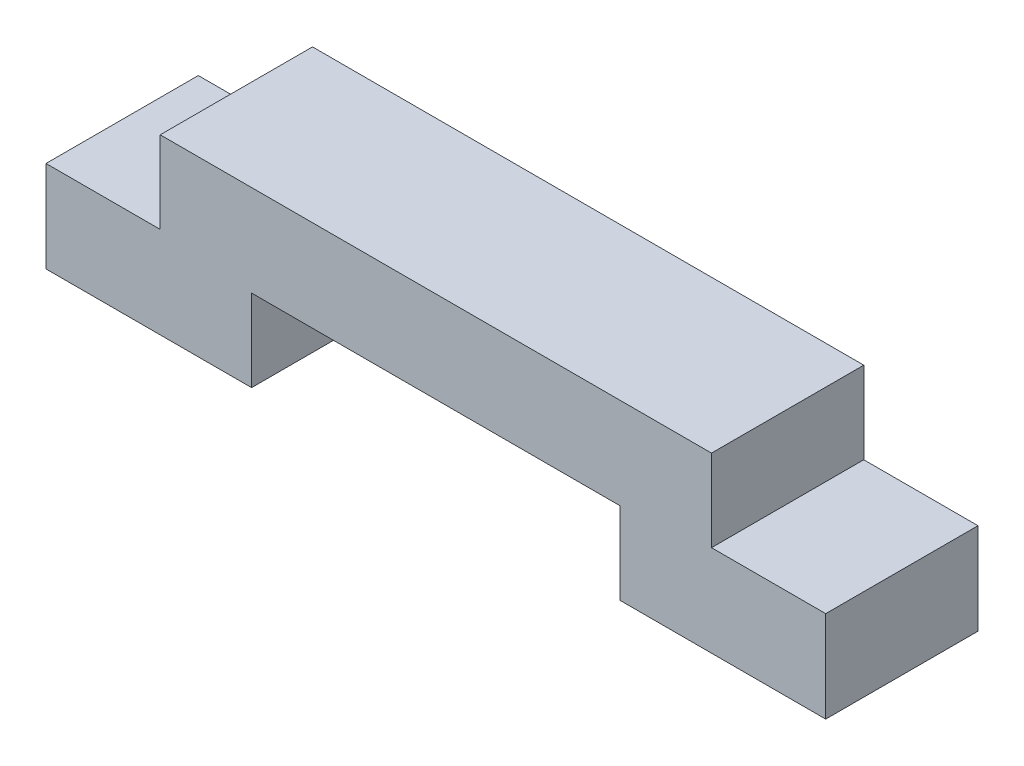
ISO-10303-21;
HEADER;
FILE_DESCRIPTION(('STEP AP214'),'2;1');
FILE_NAME('part.step','',(''),(''),'','','');
FILE_SCHEMA(('AUTOMOTIVE_DESIGN { 1 0 10303 214 1 1 1 1 }'));
ENDSEC;
DATA;
#1=APPLICATION_CONTEXT('core data for automotive mechanical design processes');
#2=APPLICATION_PROTOCOL_DEFINITION('international standard','automotive_design',2000,#1);
#3=PRODUCT_CONTEXT('',#1,'mechanical');
#4=PRODUCT('Part','Part','',(#3));
#5=PRODUCT_RELATED_PRODUCT_CATEGORY('part','',(#4));
#6=PRODUCT_DEFINITION_FORMATION('','',#4);
#7=PRODUCT_DEFINITION_CONTEXT('part definition',#1,'design');
#8=PRODUCT_DEFINITION('design','',#6,#7);
#9=PRODUCT_DEFINITION_SHAPE('','',#8);
#10=(LENGTH_UNIT() NAMED_UNIT(*) SI_UNIT(.MILLI.,.METRE.));
#11=(NAMED_UNIT(*) PLANE_ANGLE_UNIT() SI_UNIT($,.RADIAN.));
#12=(NAMED_UNIT(*) SI_UNIT($,.STERADIAN.) SOLID_ANGLE_UNIT());
#13=UNCERTAINTY_MEASURE_WITH_UNIT(LENGTH_MEASURE(1.E-05),#10,'distance_accuracy_value','');
#14=(GEOMETRIC_REPRESENTATION_CONTEXT(3) GLOBAL_UNCERTAINTY_ASSIGNED_CONTEXT((#13)) GLOBAL_UNIT_ASSIGNED_CONTEXT((#10,
#11,#12)) REPRESENTATION_CONTEXT('',''));
#15=CARTESIAN_POINT('',(0.,0.,0.));
#16=DIRECTION('',(0.,0.,1.));
#17=DIRECTION('',(1.,0.,0.));
#18=AXIS2_PLACEMENT_3D('',#15,#16,#17);
#19=CARTESIAN_POINT('',(-27.4736842105263,2.36842105263157,5.));
#20=DIRECTION('',(1.,0.,0.));
#21=DIRECTION('',(0.,0.,-1.));
#22=AXIS2_PLACEMENT_3D('',#19,#20,#21);
#23=PLANE('',#22);
#24=DIRECTION('',(0.,-1.,0.));
#25=VECTOR('',#24,1.);
#26=CARTESIAN_POINT('',(-27.4736842105263,2.36842105263157,0.));
#27=LINE('',#26,#25);
#28=CARTESIAN_POINT('',(-27.4736842105263,2.36842105263157,0.));
#29=VERTEX_POINT('',#28);
#30=CARTESIAN_POINT('',(-27.4736842105263,-0.631578947368426,0.));
#31=VERTEX_POINT('',#30);
#32=EDGE_CURVE('E162',#29,#31,#27,.T.);
#33=ORIENTED_EDGE('',*,*,#32,.T.);
#34=DIRECTION('',(0.,0.,-1.));
#35=VECTOR('',#34,1.);
#36=CARTESIAN_POINT('',(-27.4736842105263,-0.631578947368426,5.));
#37=LINE('',#36,#35);
#38=CARTESIAN_POINT('',(-27.4736842105263,-0.631578947368426,5.));
#39=VERTEX_POINT('',#38);
#40=EDGE_CURVE('E11',#39,#31,#37,.T.);
#41=ORIENTED_EDGE('',*,*,#40,.F.);
#42=DIRECTION('',(0.,-1.,0.));
#43=VECTOR('',#42,1.);
#44=CARTESIAN_POINT('',(-27.4736842105263,2.36842105263157,5.));
#45=LINE('',#44,#43);
#46=CARTESIAN_POINT('',(-27.4736842105263,2.36842105263157,5.));
#47=VERTEX_POINT('',#46);
#48=EDGE_CURVE('E183',#47,#39,#45,.T.);
#49=ORIENTED_EDGE('',*,*,#48,.F.);
#50=DIRECTION('',(0.,0.,-1.));
#51=VECTOR('',#50,1.);
#52=CARTESIAN_POINT('',(-27.4736842105263,2.36842105263157,5.));
#53=LINE('',#52,#51);
#54=EDGE_CURVE('E160',#47,#29,#53,.T.);
#55=ORIENTED_EDGE('',*,*,#54,.T.);
#56=EDGE_LOOP('',(#33,#41,#49,#55));
#57=FACE_BOUND('',#56,.T.);
#58=ADVANCED_FACE('F41',(#57),#23,.F.);
#59=CARTESIAN_POINT('',(-27.4736842105263,-0.631578947368426,5.));
#60=DIRECTION('',(0.,1.,0.));
#61=DIRECTION('',(0.,0.,1.));
#62=AXIS2_PLACEMENT_3D('',#59,#60,#61);
#63=PLANE('',#62);
#64=DIRECTION('',(1.,0.,0.));
#65=VECTOR('',#64,1.);
#66=CARTESIAN_POINT('',(-27.4736842105263,-0.631578947368426,0.));
#67=LINE('',#66,#65);
#68=CARTESIAN_POINT('',(-20.7236842105263,-0.631578947368426,0.));
#69=VERTEX_POINT('',#68);
#70=EDGE_CURVE('E164',#31,#69,#67,.T.);
#71=ORIENTED_EDGE('',*,*,#70,.T.);
#72=DIRECTION('',(0.,0.,-1.));
#73=VECTOR('',#72,1.);
#74=CARTESIAN_POINT('',(-20.7236842105263,-0.631578947368426,5.));
#75=LINE('',#74,#73);
#76=CARTESIAN_POINT('',(-20.7236842105263,-0.631578947368426,5.));
#77=VERTEX_POINT('',#76);
#78=EDGE_CURVE('E47',#77,#69,#75,.T.);
#79=ORIENTED_EDGE('',*,*,#78,.F.);
#80=DIRECTION('',(1.,0.,0.));
#81=VECTOR('',#80,1.);
#82=CARTESIAN_POINT('',(-27.4736842105263,-0.631578947368426,5.));
#83=LINE('',#82,#81);
#84=EDGE_CURVE('E115',#39,#77,#83,.T.);
#85=ORIENTED_EDGE('',*,*,#84,.F.);
#86=ORIENTED_EDGE('',*,*,#40,.T.);
#87=EDGE_LOOP('',(#71,#79,#85,#86));
#88=FACE_BOUND('',#87,.T.);
#89=ADVANCED_FACE('F263',(#88),#63,.F.);
#90=CARTESIAN_POINT('',(-20.7236842105263,-0.631578947368426,5.));
#91=DIRECTION('',(-1.,0.,0.));
#92=DIRECTION('',(0.,0.,1.));
#93=AXIS2_PLACEMENT_3D('',#90,#91,#92);
#94=PLANE('',#93);
#95=DIRECTION('',(0.,1.,0.));
#96=VECTOR('',#95,1.);
#97=CARTESIAN_POINT('',(-20.7236842105263,-0.631578947368426,0.));
#98=LINE('',#97,#96);
#99=CARTESIAN_POINT('',(-20.7236842105263,2.05842105263157,0.));
#100=VERTEX_POINT('',#99);
#101=EDGE_CURVE('E168',#69,#100,#98,.T.);
#102=ORIENTED_EDGE('',*,*,#101,.T.);
#103=DIRECTION('',(0.,0.,-1.));
#104=VECTOR('',#103,1.);
#105=CARTESIAN_POINT('',(-20.7236842105263,2.05842105263157,5.));
#106=LINE('',#105,#104);
#107=CARTESIAN_POINT('',(-20.7236842105263,2.05842105263157,5.));
#108=VERTEX_POINT('',#107);
#109=EDGE_CURVE('E205',#108,#100,#106,.T.);
#110=ORIENTED_EDGE('',*,*,#109,.F.);
#111=DIRECTION('',(0.,1.,0.));
#112=VECTOR('',#111,1.);
#113=CARTESIAN_POINT('',(-20.7236842105263,-0.631578947368426,5.));
#114=LINE('',#113,#112);
#115=EDGE_CURVE('E206',#77,#108,#114,.T.);
#116=ORIENTED_EDGE('',*,*,#115,.F.);
#117=ORIENTED_EDGE('',*,*,#78,.T.);
#118=EDGE_LOOP('',(#102,#110,#116,#117));
#119=FACE_BOUND('',#118,.T.);
#120=ADVANCED_FACE('F208',(#119),#94,.F.);
#121=CARTESIAN_POINT('',(-20.7236842105263,2.05842105263157,5.));
#122=DIRECTION('',(0.,1.,0.));
#123=DIRECTION('',(-1.,0.,0.));
#124=AXIS2_PLACEMENT_3D('',#121,#122,#123);
#125=PLANE('',#124);
#126=DIRECTION('',(1.,0.,0.));
#127=VECTOR('',#126,1.);
#128=CARTESIAN_POINT('',(-20.7236842105263,2.05842105263157,0.));
#129=LINE('',#128,#127);
#130=CARTESIAN_POINT('',(-8.62368421052626,2.05842105263158,0.));
#131=VERTEX_POINT('',#130);
#132=EDGE_CURVE('E166',#100,#131,#129,.T.);
#133=ORIENTED_EDGE('',*,*,#132,.T.);
#134=DIRECTION('',(0.,0.,-1.));
#135=VECTOR('',#134,1.);
#136=CARTESIAN_POINT('',(-8.62368421052626,2.05842105263158,5.));
#137=LINE('',#136,#135);
#138=CARTESIAN_POINT('',(-8.62368421052626,2.05842105263158,5.));
#139=VERTEX_POINT('',#138);
#140=EDGE_CURVE('E199',#139,#131,#137,.T.);
#141=ORIENTED_EDGE('',*,*,#140,.F.);
#142=DIRECTION('',(1.,0.,0.));
#143=VECTOR('',#142,1.);
#144=CARTESIAN_POINT('',(-20.7236842105263,2.05842105263157,5.));
#145=LINE('',#144,#143);
#146=EDGE_CURVE('E228',#108,#139,#145,.T.);
#147=ORIENTED_EDGE('',*,*,#146,.F.);
#148=ORIENTED_EDGE('',*,*,#109,.T.);
#149=EDGE_LOOP('',(#133,#141,#147,#148));
#150=FACE_BOUND('',#149,.T.);
#151=ADVANCED_FACE('F219',(#150),#125,.F.);
#152=CARTESIAN_POINT('',(-8.62368421052626,2.05842105263158,5.));
#153=DIRECTION('',(1.,0.,0.));
#154=DIRECTION('',(0.,0.,-1.));
#155=AXIS2_PLACEMENT_3D('',#152,#153,#154);
#156=PLANE('',#155);
#157=DIRECTION('',(0.,-1.,0.));
#158=VECTOR('',#157,1.);
#159=CARTESIAN_POINT('',(-8.62368421052626,2.05842105263158,0.));
#160=LINE('',#159,#158);
#161=CARTESIAN_POINT('',(-8.62368421052626,-0.631578947368426,0.));
#162=VERTEX_POINT('',#161);
#163=EDGE_CURVE('E169',#131,#162,#160,.T.);
#164=ORIENTED_EDGE('',*,*,#163,.T.);
#165=DIRECTION('',(0.,0.,-1.));
#166=VECTOR('',#165,1.);
#167=CARTESIAN_POINT('',(-8.62368421052626,-0.631578947368426,5.));
#168=LINE('',#167,#166);
#169=CARTESIAN_POINT('',(-8.62368421052626,-0.631578947368426,5.));
#170=VERTEX_POINT('',#169);
#171=EDGE_CURVE('E197',#170,#162,#168,.T.);
#172=ORIENTED_EDGE('',*,*,#171,.F.);
#173=DIRECTION('',(0.,-1.,0.));
#174=VECTOR('',#173,1.);
#175=CARTESIAN_POINT('',(-8.62368421052626,2.05842105263158,5.));
#176=LINE('',#175,#174);
#177=EDGE_CURVE('E224',#139,#170,#176,.T.);
#178=ORIENTED_EDGE('',*,*,#177,.F.);
#179=ORIENTED_EDGE('',*,*,#140,.T.);
#180=EDGE_LOOP('',(#164,#172,#178,#179));
#181=FACE_BOUND('',#180,.T.);
#182=ADVANCED_FACE('F223',(#181),#156,.F.);
#183=CARTESIAN_POINT('',(-8.62368421052626,-0.631578947368426,5.));
#184=DIRECTION('',(0.,1.,0.));
#185=DIRECTION('',(-1.,0.,0.));
#186=AXIS2_PLACEMENT_3D('',#183,#184,#185);
#187=PLANE('',#186);
#188=DIRECTION('',(1.,0.,0.));
#189=VECTOR('',#188,1.);
#190=CARTESIAN_POINT('',(-8.62368421052626,-0.631578947368426,0.));
#191=LINE('',#190,#189);
#192=CARTESIAN_POINT('',(-1.87368421052626,-0.631578947368426,0.));
#193=VERTEX_POINT('',#192);
#194=EDGE_CURVE('E175',#162,#193,#191,.T.);
#195=ORIENTED_EDGE('',*,*,#194,.T.);
#196=DIRECTION('',(0.,0.,-1.));
#197=VECTOR('',#196,1.);
#198=CARTESIAN_POINT('',(-1.87368421052626,-0.631578947368426,5.));
#199=LINE('',#198,#197);
#200=CARTESIAN_POINT('',(-1.87368421052626,-0.631578947368426,5.));
#201=VERTEX_POINT('',#200);
#202=EDGE_CURVE('E194',#201,#193,#199,.T.);
#203=ORIENTED_EDGE('',*,*,#202,.F.);
#204=DIRECTION('',(1.,0.,0.));
#205=VECTOR('',#204,1.);
#206=CARTESIAN_POINT('',(-8.62368421052626,-0.631578947368426,5.));
#207=LINE('',#206,#205);
#208=EDGE_CURVE('E230',#170,#201,#207,.T.);
#209=ORIENTED_EDGE('',*,*,#208,.F.);
#210=ORIENTED_EDGE('',*,*,#171,.T.);
#211=EDGE_LOOP('',(#195,#203,#209,#210));
#212=FACE_BOUND('',#211,.T.);
#213=ADVANCED_FACE('F272',(#212),#187,.F.);
#214=CARTESIAN_POINT('',(-1.87368421052626,-0.631578947368426,5.));
#215=DIRECTION('',(-1.,0.,0.));
#216=DIRECTION('',(0.,0.,1.));
#217=AXIS2_PLACEMENT_3D('',#214,#215,#216);
#218=PLANE('',#217);
#219=DIRECTION('',(0.,1.,0.));
#220=VECTOR('',#219,1.);
#221=CARTESIAN_POINT('',(-1.87368421052626,-0.631578947368426,0.));
#222=LINE('',#221,#220);
#223=CARTESIAN_POINT('',(-1.87368421052626,2.36842105263158,0.));
#224=VERTEX_POINT('',#223);
#225=EDGE_CURVE('E174',#193,#224,#222,.T.);
#226=ORIENTED_EDGE('',*,*,#225,.T.);
#227=DIRECTION('',(0.,0.,-1.));
#228=VECTOR('',#227,1.);
#229=CARTESIAN_POINT('',(-1.87368421052626,2.36842105263158,5.));
#230=LINE('',#229,#228);
#231=CARTESIAN_POINT('',(-1.87368421052626,2.36842105263158,5.));
#232=VERTEX_POINT('',#231);
#233=EDGE_CURVE('E189',#232,#224,#230,.T.);
#234=ORIENTED_EDGE('',*,*,#233,.F.);
#235=DIRECTION('',(0.,1.,0.));
#236=VECTOR('',#235,1.);
#237=CARTESIAN_POINT('',(-1.87368421052626,-0.631578947368426,5.));
#238=LINE('',#237,#236);
#239=EDGE_CURVE('E229',#201,#232,#238,.T.);
#240=ORIENTED_EDGE('',*,*,#239,.F.);
#241=ORIENTED_EDGE('',*,*,#202,.T.);
#242=EDGE_LOOP('',(#226,#234,#240,#241));
#243=FACE_BOUND('',#242,.T.);
#244=ADVANCED_FACE('F280',(#243),#218,.F.);
#245=CARTESIAN_POINT('',(-1.87368421052626,2.36842105263158,5.));
#246=DIRECTION('',(0.,-1.,0.));
#247=DIRECTION('',(1.,0.,0.));
#248=AXIS2_PLACEMENT_3D('',#245,#246,#247);
#249=PLANE('',#248);
#250=DIRECTION('',(-1.,0.,0.));
#251=VECTOR('',#250,1.);
#252=CARTESIAN_POINT('',(-1.87368421052626,2.36842105263158,0.));
#253=LINE('',#252,#251);
#254=CARTESIAN_POINT('',(-5.62368421052626,2.36842105263158,0.));
#255=VERTEX_POINT('',#254);
#256=EDGE_CURVE('E176',#224,#255,#253,.T.);
#257=ORIENTED_EDGE('',*,*,#256,.T.);
#258=DIRECTION('',(0.,0.,-1.));
#259=VECTOR('',#258,1.);
#260=CARTESIAN_POINT('',(-5.62368421052626,2.36842105263158,5.));
#261=LINE('',#260,#259);
#262=CARTESIAN_POINT('',(-5.62368421052626,2.36842105263158,5.));
#263=VERTEX_POINT('',#262);
#264=EDGE_CURVE('E190',#263,#255,#261,.T.);
#265=ORIENTED_EDGE('',*,*,#264,.F.);
#266=DIRECTION('',(-1.,0.,0.));
#267=VECTOR('',#266,1.);
#268=CARTESIAN_POINT('',(-1.87368421052626,2.36842105263158,5.));
#269=LINE('',#268,#267);
#270=EDGE_CURVE('E237',#232,#263,#269,.T.);
#271=ORIENTED_EDGE('',*,*,#270,.F.);
#272=ORIENTED_EDGE('',*,*,#233,.T.);
#273=EDGE_LOOP('',(#257,#265,#271,#272));
#274=FACE_BOUND('',#273,.T.);
#275=ADVANCED_FACE('F245',(#274),#249,.F.);
#276=CARTESIAN_POINT('',(-5.62368421052626,2.36842105263158,5.));
#277=DIRECTION('',(-1.,0.,0.));
#278=DIRECTION('',(0.,0.,1.));
#279=AXIS2_PLACEMENT_3D('',#276,#277,#278);
#280=PLANE('',#279);
#281=DIRECTION('',(0.,1.,0.));
#282=VECTOR('',#281,1.);
#283=CARTESIAN_POINT('',(-5.62368421052626,2.36842105263158,0.));
#284=LINE('',#283,#282);
#285=CARTESIAN_POINT('',(-5.62368421052626,5.05842105263158,0.));
#286=VERTEX_POINT('',#285);
#287=EDGE_CURVE('E178',#255,#286,#284,.T.);
#288=ORIENTED_EDGE('',*,*,#287,.T.);
#289=DIRECTION('',(0.,0.,-1.));
#290=VECTOR('',#289,1.);
#291=CARTESIAN_POINT('',(-5.62368421052626,5.05842105263158,5.));
#292=LINE('',#291,#290);
#293=CARTESIAN_POINT('',(-5.62368421052626,5.05842105263158,5.));
#294=VERTEX_POINT('',#293);
#295=EDGE_CURVE('E155',#294,#286,#292,.T.);
#296=ORIENTED_EDGE('',*,*,#295,.F.);
#297=DIRECTION('',(0.,1.,0.));
#298=VECTOR('',#297,1.);
#299=CARTESIAN_POINT('',(-5.62368421052626,2.36842105263158,5.));
#300=LINE('',#299,#298);
#301=EDGE_CURVE('E142',#263,#294,#300,.T.);
#302=ORIENTED_EDGE('',*,*,#301,.F.);
#303=ORIENTED_EDGE('',*,*,#264,.T.);
#304=EDGE_LOOP('',(#288,#296,#302,#303));
#305=FACE_BOUND('',#304,.T.);
#306=ADVANCED_FACE('F247',(#305),#280,.F.);
#307=CARTESIAN_POINT('',(-5.62368421052626,5.05842105263158,5.));
#308=DIRECTION('',(0.,-1.,0.));
#309=DIRECTION('',(1.,0.,0.));
#310=AXIS2_PLACEMENT_3D('',#307,#308,#309);
#311=PLANE('',#310);
#312=DIRECTION('',(-1.,0.,0.));
#313=VECTOR('',#312,1.);
#314=CARTESIAN_POINT('',(-5.62368421052626,5.05842105263158,0.));
#315=LINE('',#314,#313);
#316=CARTESIAN_POINT('',(-23.7236842105263,5.05842105263157,0.));
#317=VERTEX_POINT('',#316);
#318=EDGE_CURVE('E152',#286,#317,#315,.T.);
#319=ORIENTED_EDGE('',*,*,#318,.T.);
#320=DIRECTION('',(0.,0.,-1.));
#321=VECTOR('',#320,1.);
#322=CARTESIAN_POINT('',(-23.7236842105263,5.05842105263157,5.));
#323=LINE('',#322,#321);
#324=CARTESIAN_POINT('',(-23.7236842105263,5.05842105263157,5.));
#325=VERTEX_POINT('',#324);
#326=EDGE_CURVE('E149',#325,#317,#323,.T.);
#327=ORIENTED_EDGE('',*,*,#326,.F.);
#328=DIRECTION('',(-1.,0.,0.));
#329=VECTOR('',#328,1.);
#330=CARTESIAN_POINT('',(-5.62368421052626,5.05842105263158,5.));
#331=LINE('',#330,#329);
#332=EDGE_CURVE('E140',#294,#325,#331,.T.);
#333=ORIENTED_EDGE('',*,*,#332,.F.);
#334=ORIENTED_EDGE('',*,*,#295,.T.);
#335=EDGE_LOOP('',(#319,#327,#333,#334));
#336=FACE_BOUND('',#335,.T.);
#337=ADVANCED_FACE('F146',(#336),#311,.F.);
#338=CARTESIAN_POINT('',(-23.7236842105263,5.05842105263157,5.));
#339=DIRECTION('',(1.,0.,0.));
#340=DIRECTION('',(0.,0.,-1.));
#341=AXIS2_PLACEMENT_3D('',#338,#339,#340);
#342=PLANE('',#341);
#343=DIRECTION('',(0.,-1.,0.));
#344=VECTOR('',#343,1.);
#345=CARTESIAN_POINT('',(-23.7236842105263,5.05842105263157,0.));
#346=LINE('',#345,#344);
#347=CARTESIAN_POINT('',(-23.7236842105263,2.36842105263157,0.));
#348=VERTEX_POINT('',#347);
#349=EDGE_CURVE('E97',#317,#348,#346,.T.);
#350=ORIENTED_EDGE('',*,*,#349,.T.);
#351=DIRECTION('',(0.,0.,-1.));
#352=VECTOR('',#351,1.);
#353=CARTESIAN_POINT('',(-23.7236842105263,2.36842105263157,5.));
#354=LINE('',#353,#352);
#355=CARTESIAN_POINT('',(-23.7236842105263,2.36842105263157,5.));
#356=VERTEX_POINT('',#355);
#357=EDGE_CURVE('E153',#356,#348,#354,.T.);
#358=ORIENTED_EDGE('',*,*,#357,.F.);
#359=DIRECTION('',(0.,-1.,0.));
#360=VECTOR('',#359,1.);
#361=CARTESIAN_POINT('',(-23.7236842105263,5.05842105263157,5.));
#362=LINE('',#361,#360);
#363=EDGE_CURVE('E141',#325,#356,#362,.T.);
#364=ORIENTED_EDGE('',*,*,#363,.F.);
#365=ORIENTED_EDGE('',*,*,#326,.T.);
#366=EDGE_LOOP('',(#350,#358,#364,#365));
#367=FACE_BOUND('',#366,.T.);
#368=ADVANCED_FACE('F151',(#367),#342,.F.);
#369=CARTESIAN_POINT('',(-23.7236842105263,2.36842105263157,5.));
#370=DIRECTION('',(0.,-1.,0.));
#371=DIRECTION('',(1.,0.,0.));
#372=AXIS2_PLACEMENT_3D('',#369,#370,#371);
#373=PLANE('',#372);
#374=DIRECTION('',(-1.,0.,0.));
#375=VECTOR('',#374,1.);
#376=CARTESIAN_POINT('',(-23.7236842105263,2.36842105263157,0.));
#377=LINE('',#376,#375);
#378=EDGE_CURVE('E101',#348,#29,#377,.T.);
#379=ORIENTED_EDGE('',*,*,#378,.T.);
#380=ORIENTED_EDGE('',*,*,#54,.F.);
#381=DIRECTION('',(-1.,0.,0.));
#382=VECTOR('',#381,1.);
#383=CARTESIAN_POINT('',(-23.7236842105263,2.36842105263157,5.));
#384=LINE('',#383,#382);
#385=EDGE_CURVE('E60',#356,#47,#384,.T.);
#386=ORIENTED_EDGE('',*,*,#385,.F.);
#387=ORIENTED_EDGE('',*,*,#357,.T.);
#388=EDGE_LOOP('',(#379,#380,#386,#387));
#389=FACE_BOUND('',#388,.T.);
#390=ADVANCED_FACE('F248',(#389),#373,.F.);
#391=CARTESIAN_POINT('',(0.,0.,5.));
#392=DIRECTION('',(0.,0.,1.));
#393=DIRECTION('',(1.,0.,0.));
#394=AXIS2_PLACEMENT_3D('',#391,#392,#393);
#395=PLANE('',#394);
#396=ORIENTED_EDGE('',*,*,#48,.T.);
#397=ORIENTED_EDGE('',*,*,#84,.T.);
#398=ORIENTED_EDGE('',*,*,#115,.T.);
#399=ORIENTED_EDGE('',*,*,#146,.T.);
#400=ORIENTED_EDGE('',*,*,#177,.T.);
#401=ORIENTED_EDGE('',*,*,#208,.T.);
#402=ORIENTED_EDGE('',*,*,#239,.T.);
#403=ORIENTED_EDGE('',*,*,#270,.T.);
#404=ORIENTED_EDGE('',*,*,#301,.T.);
#405=ORIENTED_EDGE('',*,*,#332,.T.);
#406=ORIENTED_EDGE('',*,*,#363,.T.);
#407=ORIENTED_EDGE('',*,*,#385,.T.);
#408=EDGE_LOOP('',(#396,#397,#398,#399,#400,#401,#402,#403,#404,#405,#406,#407));
#409=FACE_BOUND('',#408,.T.);
#410=ADVANCED_FACE('F137',(#409),#395,.T.);
#411=CARTESIAN_POINT('',(0.,0.,0.));
#412=DIRECTION('',(0.,0.,1.));
#413=DIRECTION('',(1.,0.,0.));
#414=AXIS2_PLACEMENT_3D('',#411,#412,#413);
#415=PLANE('',#414);
#416=ORIENTED_EDGE('',*,*,#32,.F.);
#417=ORIENTED_EDGE('',*,*,#378,.F.);
#418=ORIENTED_EDGE('',*,*,#349,.F.);
#419=ORIENTED_EDGE('',*,*,#318,.F.);
#420=ORIENTED_EDGE('',*,*,#287,.F.);
#421=ORIENTED_EDGE('',*,*,#256,.F.);
#422=ORIENTED_EDGE('',*,*,#225,.F.);
#423=ORIENTED_EDGE('',*,*,#194,.F.);
#424=ORIENTED_EDGE('',*,*,#163,.F.);
#425=ORIENTED_EDGE('',*,*,#132,.F.);
#426=ORIENTED_EDGE('',*,*,#101,.F.);
#427=ORIENTED_EDGE('',*,*,#70,.F.);
#428=EDGE_LOOP('',(#416,#417,#418,#419,#420,#421,#422,#423,#424,#425,#426,#427));
#429=FACE_BOUND('',#428,.T.);
#430=ADVANCED_FACE('F215',(#429),#415,.F.);
#431=CLOSED_SHELL('',(#58,#89,#120,#151,#182,#213,#244,#275,#306,#337,#368,#390,#410,#430));
#432=MANIFOLD_SOLID_BREP('B2',#431);
#433=ADVANCED_BREP_SHAPE_REPRESENTATION('',(#18,#432),#14);
#434=SHAPE_DEFINITION_REPRESENTATION(#9,#433);
ENDSEC;
END-ISO-10303-21;
